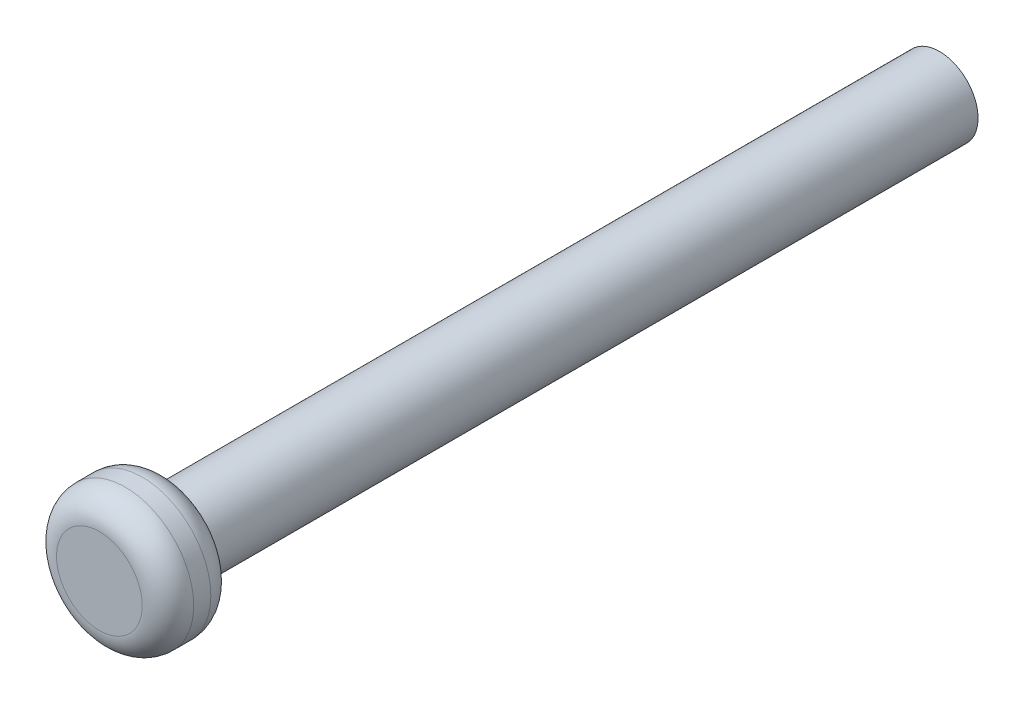
ISO-10303-21;
HEADER;
FILE_DESCRIPTION(('STEP AP214'),'2;1');
FILE_NAME('part.step','',(''),(''),'','','');
FILE_SCHEMA(('AUTOMOTIVE_DESIGN { 1 0 10303 214 1 1 1 1 }'));
ENDSEC;
DATA;
#1=APPLICATION_CONTEXT('core data for automotive mechanical design processes');
#2=APPLICATION_PROTOCOL_DEFINITION('international standard','automotive_design',2000,#1);
#3=PRODUCT_CONTEXT('',#1,'mechanical');
#4=PRODUCT('Part','Part','',(#3));
#5=PRODUCT_RELATED_PRODUCT_CATEGORY('part','',(#4));
#6=PRODUCT_DEFINITION_FORMATION('','',#4);
#7=PRODUCT_DEFINITION_CONTEXT('part definition',#1,'design');
#8=PRODUCT_DEFINITION('design','',#6,#7);
#9=PRODUCT_DEFINITION_SHAPE('','',#8);
#10=(LENGTH_UNIT() NAMED_UNIT(*) SI_UNIT(.MILLI.,.METRE.));
#11=(NAMED_UNIT(*) PLANE_ANGLE_UNIT() SI_UNIT($,.RADIAN.));
#12=(NAMED_UNIT(*) SI_UNIT($,.STERADIAN.) SOLID_ANGLE_UNIT());
#13=UNCERTAINTY_MEASURE_WITH_UNIT(LENGTH_MEASURE(1.E-05),#10,'distance_accuracy_value','');
#14=(GEOMETRIC_REPRESENTATION_CONTEXT(3) GLOBAL_UNCERTAINTY_ASSIGNED_CONTEXT((#13)) GLOBAL_UNIT_ASSIGNED_CONTEXT((#10,
#11,#12)) REPRESENTATION_CONTEXT('',''));
#15=CARTESIAN_POINT('',(0.,0.,0.));
#16=DIRECTION('',(0.,0.,1.));
#17=DIRECTION('',(1.,0.,0.));
#18=AXIS2_PLACEMENT_3D('',#15,#16,#17);
#19=CARTESIAN_POINT('',(0.,0.,45.));
#20=DIRECTION('',(0.,0.,-1.));
#21=DIRECTION('',(-1.,0.,0.));
#22=AXIS2_PLACEMENT_3D('',#19,#20,#21);
#23=CYLINDRICAL_SURFACE('',#22,2.25);
#24=CARTESIAN_POINT('',(0.,0.,45.));
#25=DIRECTION('',(0.,0.,1.));
#26=DIRECTION('',(1.,0.,0.));
#27=AXIS2_PLACEMENT_3D('',#24,#25,#26);
#28=CIRCLE('',#27,2.25);
#29=CARTESIAN_POINT('',(-2.25,0.,45.));
#30=VERTEX_POINT('',#29);
#31=EDGE_CURVE('E51',#30,#30,#28,.T.);
#32=CARTESIAN_POINT('',(0.,0.,0.));
#33=DIRECTION('',(0.,0.,1.));
#34=DIRECTION('',(1.,0.,0.));
#35=AXIS2_PLACEMENT_3D('',#32,#33,#34);
#36=CIRCLE('',#35,2.25);
#37=CARTESIAN_POINT('',(-2.25,0.,0.));
#38=VERTEX_POINT('',#37);
#39=EDGE_CURVE('E52',#38,#38,#36,.T.);
#40=CARTESIAN_POINT('',(-2.25,0.,45.));
#41=CARTESIAN_POINT('',(-2.25,0.,44.53125));
#42=CARTESIAN_POINT('',(-2.25,0.,44.0625));
#43=CARTESIAN_POINT('',(-2.25,0.,43.125));
#44=CARTESIAN_POINT('',(-2.25,0.,42.65625));
#45=CARTESIAN_POINT('',(-2.25,0.,41.71875));
#46=CARTESIAN_POINT('',(-2.25,0.,41.25));
#47=CARTESIAN_POINT('',(-2.25,0.,40.3125));
#48=CARTESIAN_POINT('',(-2.25,0.,39.84375));
#49=CARTESIAN_POINT('',(-2.25,0.,38.90625));
#50=CARTESIAN_POINT('',(-2.25,0.,38.4375));
#51=CARTESIAN_POINT('',(-2.25,0.,37.5));
#52=CARTESIAN_POINT('',(-2.25,0.,37.03125));
#53=CARTESIAN_POINT('',(-2.25,0.,36.09375));
#54=CARTESIAN_POINT('',(-2.25,0.,35.625));
#55=CARTESIAN_POINT('',(-2.25,0.,34.6875));
#56=CARTESIAN_POINT('',(-2.25,0.,34.21875));
#57=CARTESIAN_POINT('',(-2.25,0.,33.28125));
#58=CARTESIAN_POINT('',(-2.25,0.,32.8125));
#59=CARTESIAN_POINT('',(-2.25,0.,31.875));
#60=CARTESIAN_POINT('',(-2.25,0.,31.40625));
#61=CARTESIAN_POINT('',(-2.25,0.,30.46875));
#62=CARTESIAN_POINT('',(-2.25,0.,30.));
#63=CARTESIAN_POINT('',(-2.25,0.,29.0625));
#64=CARTESIAN_POINT('',(-2.25,0.,28.59375));
#65=CARTESIAN_POINT('',(-2.25,0.,27.65625));
#66=CARTESIAN_POINT('',(-2.25,0.,27.1875));
#67=CARTESIAN_POINT('',(-2.25,0.,26.25));
#68=CARTESIAN_POINT('',(-2.25,0.,25.78125));
#69=CARTESIAN_POINT('',(-2.25,0.,24.84375));
#70=CARTESIAN_POINT('',(-2.25,0.,24.375));
#71=CARTESIAN_POINT('',(-2.25,0.,23.4375));
#72=CARTESIAN_POINT('',(-2.25,0.,22.96875));
#73=CARTESIAN_POINT('',(-2.25,0.,22.03125));
#74=CARTESIAN_POINT('',(-2.25,0.,21.5625));
#75=CARTESIAN_POINT('',(-2.25,0.,20.625));
#76=CARTESIAN_POINT('',(-2.25,0.,20.15625));
#77=CARTESIAN_POINT('',(-2.25,0.,19.21875));
#78=CARTESIAN_POINT('',(-2.25,0.,18.75));
#79=CARTESIAN_POINT('',(-2.25,0.,17.8125));
#80=CARTESIAN_POINT('',(-2.25,0.,17.34375));
#81=CARTESIAN_POINT('',(-2.25,0.,16.40625));
#82=CARTESIAN_POINT('',(-2.25,0.,15.9375));
#83=CARTESIAN_POINT('',(-2.25,0.,15.));
#84=CARTESIAN_POINT('',(-2.25,0.,14.53125));
#85=CARTESIAN_POINT('',(-2.25,0.,13.59375));
#86=CARTESIAN_POINT('',(-2.25,0.,13.125));
#87=CARTESIAN_POINT('',(-2.25,0.,12.1875));
#88=CARTESIAN_POINT('',(-2.25,0.,11.71875));
#89=CARTESIAN_POINT('',(-2.25,0.,10.78125));
#90=CARTESIAN_POINT('',(-2.25,0.,10.3125));
#91=CARTESIAN_POINT('',(-2.25,0.,9.375));
#92=CARTESIAN_POINT('',(-2.25,0.,8.90625));
#93=CARTESIAN_POINT('',(-2.25,0.,7.96874999999999));
#94=CARTESIAN_POINT('',(-2.25,0.,7.5));
#95=CARTESIAN_POINT('',(-2.25,0.,6.5625));
#96=CARTESIAN_POINT('',(-2.25,0.,6.09375));
#97=CARTESIAN_POINT('',(-2.25,0.,5.15625));
#98=CARTESIAN_POINT('',(-2.25,0.,4.68749999999999));
#99=CARTESIAN_POINT('',(-2.25,0.,3.74999999999999));
#100=CARTESIAN_POINT('',(-2.25,0.,3.28124999999999));
#101=CARTESIAN_POINT('',(-2.25,0.,2.34374999999999));
#102=CARTESIAN_POINT('',(-2.25,0.,1.87499999999999));
#103=CARTESIAN_POINT('',(-2.25,0.,0.937499999999992));
#104=CARTESIAN_POINT('',(-2.25,0.,0.468749999999993));
#105=CARTESIAN_POINT('',(-2.25,0.,0.));
#106=B_SPLINE_CURVE_WITH_KNOTS('',3,(#40,#41,#42,#43,#44,#45,#46,#47,#48,#49,#50,#51,#52,#53,
#54,#55,#56,#57,#58,#59,#60,#61,#62,#63,#64,#65,#66,#67,#68,#69,#70,#71,#72,#73,#74,#75,#76,#77,
#78,#79,#80,#81,#82,#83,#84,#85,#86,#87,#88,#89,#90,#91,#92,#93,#94,#95,#96,#97,#98,#99,#100,
#101,#102,#103,#104,#105),.UNSPECIFIED.,.F.,.F.,(4,2,2,2,2,2,2,2,2,2,2,2,2,2,2,2,2,2,2,2,2,2,2,
2,2,2,2,2,2,2,2,2,4),(0.,1.40625,2.8125,4.21875000000001,5.62500000000001,7.03125,8.4375,
9.84375000000001,11.25,12.65625,14.0625,15.46875,16.875,18.28125,19.6875,21.09375,22.5,23.90625,
25.3125,26.71875,28.125,29.53125,30.9375,32.34375,33.75,35.15625,36.5625,37.96875,39.375,
40.78125,42.1875,43.59375,45.),.UNSPECIFIED.);
#107=EDGE_CURVE('BSEAM31',#30,#38,#106,.T.);
#108=ORIENTED_EDGE('',*,*,#31,.F.);
#109=ORIENTED_EDGE('',*,*,#39,.T.);
#110=ORIENTED_EDGE('',*,*,#107,.T.);
#111=ORIENTED_EDGE('',*,*,#107,.F.);
#112=EDGE_LOOP('',(#108,#110,#109,#111));
#113=FACE_BOUND('',#112,.T.);
#114=ADVANCED_FACE('F31',(#113),#23,.T.);
#115=CARTESIAN_POINT('',(0.,0.,0.));
#116=DIRECTION('',(0.,0.,1.));
#117=DIRECTION('',(1.,0.,0.));
#118=AXIS2_PLACEMENT_3D('',#115,#116,#117);
#119=PLANE('',#118);
#120=ORIENTED_EDGE('',*,*,#39,.F.);
#121=EDGE_LOOP('',(#120));
#122=FACE_BOUND('',#121,.T.);
#123=ADVANCED_FACE('F62',(#122),#119,.F.);
#124=CARTESIAN_POINT('',(0.,0.,49.));
#125=DIRECTION('',(0.,0.,-1.));
#126=DIRECTION('',(-1.,0.,0.));
#127=AXIS2_PLACEMENT_3D('',#124,#125,#126);
#128=CYLINDRICAL_SURFACE('',#127,4.);
#129=CARTESIAN_POINT('',(0.,0.,46.5));
#130=DIRECTION('',(0.,0.,1.));
#131=DIRECTION('',(1.,0.,0.));
#132=AXIS2_PLACEMENT_3D('',#129,#130,#131);
#133=CIRCLE('',#132,4.);
#134=CARTESIAN_POINT('',(4.,0.,46.5));
#135=VERTEX_POINT('',#134);
#136=EDGE_CURVE('E42',#135,#135,#133,.T.);
#137=ORIENTED_EDGE('',*,*,#136,.T.);
#138=EDGE_LOOP('',(#137));
#139=FACE_BOUND('',#138,.T.);
#140=CARTESIAN_POINT('',(0.,0.,47.5));
#141=DIRECTION('',(0.,0.,1.));
#142=DIRECTION('',(1.,0.,0.));
#143=AXIS2_PLACEMENT_3D('',#140,#141,#142);
#144=CIRCLE('',#143,4.);
#145=CARTESIAN_POINT('',(4.,0.,47.5));
#146=VERTEX_POINT('',#145);
#147=EDGE_CURVE('E46',#146,#146,#144,.F.);
#148=ORIENTED_EDGE('',*,*,#147,.T.);
#149=EDGE_LOOP('',(#148));
#150=FACE_BOUND('',#149,.T.);
#151=ADVANCED_FACE('F67',(#139,#150),#128,.T.);
#152=CARTESIAN_POINT('',(0.,0.,49.));
#153=DIRECTION('',(0.,0.,1.));
#154=DIRECTION('',(1.,0.,0.));
#155=AXIS2_PLACEMENT_3D('',#152,#153,#154);
#156=PLANE('',#155);
#157=CARTESIAN_POINT('',(0.,0.,49.));
#158=DIRECTION('',(0.,0.,1.));
#159=DIRECTION('',(1.,0.,0.));
#160=AXIS2_PLACEMENT_3D('',#157,#158,#159);
#161=CIRCLE('',#160,2.5);
#162=CARTESIAN_POINT('',(2.5,0.,49.));
#163=VERTEX_POINT('',#162);
#164=EDGE_CURVE('E10',#163,#163,#161,.T.);
#165=ORIENTED_EDGE('',*,*,#164,.T.);
#166=EDGE_LOOP('',(#165));
#167=FACE_BOUND('',#166,.T.);
#168=ADVANCED_FACE('F72',(#167),#156,.T.);
#169=CARTESIAN_POINT('',(0.,0.,45.));
#170=DIRECTION('',(0.,0.,1.));
#171=DIRECTION('',(1.,0.,0.));
#172=AXIS2_PLACEMENT_3D('',#169,#170,#171);
#173=PLANE('',#172);
#174=CARTESIAN_POINT('',(0.,0.,45.));
#175=DIRECTION('',(0.,0.,1.));
#176=DIRECTION('',(1.,0.,0.));
#177=AXIS2_PLACEMENT_3D('',#174,#175,#176);
#178=CIRCLE('',#177,2.5);
#179=CARTESIAN_POINT('',(2.5,0.,45.));
#180=VERTEX_POINT('',#179);
#181=EDGE_CURVE('E38',#180,#180,#178,.F.);
#182=ORIENTED_EDGE('',*,*,#181,.T.);
#183=EDGE_LOOP('',(#182));
#184=FACE_BOUND('',#183,.T.);
#185=ORIENTED_EDGE('',*,*,#31,.T.);
#186=EDGE_LOOP('',(#185));
#187=FACE_BOUND('',#186,.T.);
#188=ADVANCED_FACE('F58',(#184,#187),#173,.F.);
#189=CARTESIAN_POINT('',(0.,0.,46.5));
#190=DIRECTION('',(0.,0.,1.));
#191=DIRECTION('',(1.,0.,0.));
#192=AXIS2_PLACEMENT_3D('',#189,#190,#191);
#193=TOROIDAL_SURFACE('',#192,2.5,1.5);
#194=ORIENTED_EDGE('',*,*,#181,.F.);
#195=EDGE_LOOP('',(#194));
#196=FACE_BOUND('',#195,.T.);
#197=ORIENTED_EDGE('',*,*,#136,.F.);
#198=EDGE_LOOP('',(#197));
#199=FACE_BOUND('',#198,.T.);
#200=ADVANCED_FACE('F76',(#196,#199),#193,.T.);
#201=CARTESIAN_POINT('',(0.,0.,47.5));
#202=DIRECTION('',(0.,0.,1.));
#203=DIRECTION('',(1.,0.,0.));
#204=AXIS2_PLACEMENT_3D('',#201,#202,#203);
#205=TOROIDAL_SURFACE('',#204,2.5,1.5);
#206=ORIENTED_EDGE('',*,*,#147,.F.);
#207=EDGE_LOOP('',(#206));
#208=FACE_BOUND('',#207,.T.);
#209=ORIENTED_EDGE('',*,*,#164,.F.);
#210=EDGE_LOOP('',(#209));
#211=FACE_BOUND('',#210,.T.);
#212=ADVANCED_FACE('F33',(#208,#211),#205,.T.);
#213=CLOSED_SHELL('',(#114,#123,#151,#168,#188,#200,#212));
#214=MANIFOLD_SOLID_BREP('B2',#213);
#215=ADVANCED_BREP_SHAPE_REPRESENTATION('',(#18,#214),#14);
#216=SHAPE_DEFINITION_REPRESENTATION(#9,#215);
ENDSEC;
END-ISO-10303-21;
